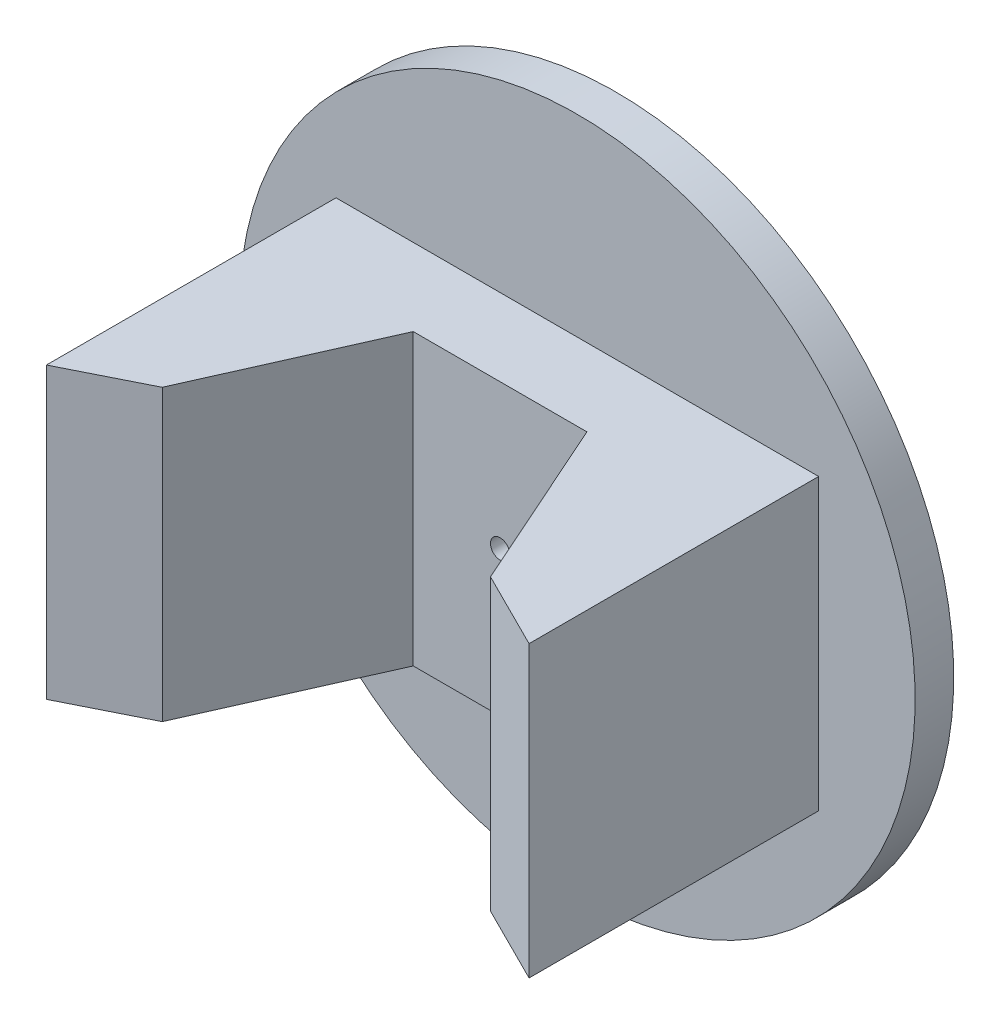
ISO-10303-21;
HEADER;
FILE_DESCRIPTION(('STEP AP214'),'2;1');
FILE_NAME('part.step','',(''),(''),'','','');
FILE_SCHEMA(('AUTOMOTIVE_DESIGN { 1 0 10303 214 1 1 1 1 }'));
ENDSEC;
DATA;
#1=APPLICATION_CONTEXT('core data for automotive mechanical design processes');
#2=APPLICATION_PROTOCOL_DEFINITION('international standard','automotive_design',2000,#1);
#3=PRODUCT_CONTEXT('',#1,'mechanical');
#4=PRODUCT('Part','Part','',(#3));
#5=PRODUCT_RELATED_PRODUCT_CATEGORY('part','',(#4));
#6=PRODUCT_DEFINITION_FORMATION('','',#4);
#7=PRODUCT_DEFINITION_CONTEXT('part definition',#1,'design');
#8=PRODUCT_DEFINITION('design','',#6,#7);
#9=PRODUCT_DEFINITION_SHAPE('','',#8);
#10=(LENGTH_UNIT() NAMED_UNIT(*) SI_UNIT(.MILLI.,.METRE.));
#11=(NAMED_UNIT(*) PLANE_ANGLE_UNIT() SI_UNIT($,.RADIAN.));
#12=(NAMED_UNIT(*) SI_UNIT($,.STERADIAN.) SOLID_ANGLE_UNIT());
#13=UNCERTAINTY_MEASURE_WITH_UNIT(LENGTH_MEASURE(1.E-05),#10,'distance_accuracy_value','');
#14=(GEOMETRIC_REPRESENTATION_CONTEXT(3) GLOBAL_UNCERTAINTY_ASSIGNED_CONTEXT((#13)) GLOBAL_UNIT_ASSIGNED_CONTEXT((#10,
#11,#12)) REPRESENTATION_CONTEXT('',''));
#15=CARTESIAN_POINT('',(0.,0.,0.));
#16=DIRECTION('',(0.,0.,1.));
#17=DIRECTION('',(1.,0.,0.));
#18=AXIS2_PLACEMENT_3D('',#15,#16,#17);
#19=CARTESIAN_POINT('',(0.,7.5,-5.));
#20=DIRECTION('',(0.,0.,-1.));
#21=DIRECTION('',(-1.,0.,0.));
#22=AXIS2_PLACEMENT_3D('',#19,#20,#21);
#23=PLANE('',#22);
#24=CARTESIAN_POINT('',(0.,7.5,-5.));
#25=DIRECTION('',(0.,0.,-1.));
#26=DIRECTION('',(-1.,0.,0.));
#27=AXIS2_PLACEMENT_3D('',#24,#25,#26);
#28=CIRCLE('',#27,9.99999999999999);
#29=CARTESIAN_POINT('',(-10.,7.5,-5.));
#30=VERTEX_POINT('',#29);
#31=EDGE_CURVE('E178',#30,#30,#28,.T.);
#32=ORIENTED_EDGE('',*,*,#31,.T.);
#33=EDGE_LOOP('',(#32));
#34=FACE_BOUND('',#33,.T.);
#35=CARTESIAN_POINT('',(0.,7.5,-5.));
#36=DIRECTION('',(0.,0.,-1.));
#37=DIRECTION('',(-1.,0.,0.));
#38=AXIS2_PLACEMENT_3D('',#35,#36,#37);
#39=CIRCLE('',#38,5.);
#40=CARTESIAN_POINT('',(-5.,7.5,-5.));
#41=VERTEX_POINT('',#40);
#42=EDGE_CURVE('E168',#41,#41,#39,.T.);
#43=ORIENTED_EDGE('',*,*,#42,.F.);
#44=EDGE_LOOP('',(#43));
#45=FACE_BOUND('',#44,.T.);
#46=ADVANCED_FACE('F35',(#34,#45),#23,.T.);
#47=CARTESIAN_POINT('',(0.,7.5,-2.));
#48=DIRECTION('',(0.,0.,-1.));
#49=DIRECTION('',(-1.,0.,0.));
#50=AXIS2_PLACEMENT_3D('',#47,#48,#49);
#51=PLANE('',#50);
#52=CARTESIAN_POINT('',(0.,7.5,-2.));
#53=DIRECTION('',(0.,0.,-1.));
#54=DIRECTION('',(-1.,0.,0.));
#55=AXIS2_PLACEMENT_3D('',#52,#53,#54);
#56=CIRCLE('',#55,17.5);
#57=CARTESIAN_POINT('',(-17.5,7.5,-2.));
#58=VERTEX_POINT('',#57);
#59=EDGE_CURVE('E137',#58,#58,#56,.T.);
#60=ORIENTED_EDGE('',*,*,#59,.T.);
#61=EDGE_LOOP('',(#60));
#62=FACE_BOUND('',#61,.T.);
#63=CARTESIAN_POINT('',(0.,7.5,-2.));
#64=DIRECTION('',(0.,0.,-1.));
#65=DIRECTION('',(-1.,0.,0.));
#66=AXIS2_PLACEMENT_3D('',#63,#64,#65);
#67=CIRCLE('',#66,9.99999999999999);
#68=CARTESIAN_POINT('',(-10.,7.5,-2.));
#69=VERTEX_POINT('',#68);
#70=EDGE_CURVE('E166',#69,#69,#67,.T.);
#71=ORIENTED_EDGE('',*,*,#70,.F.);
#72=EDGE_LOOP('',(#71));
#73=FACE_BOUND('',#72,.T.);
#74=ADVANCED_FACE('F222',(#62,#73),#51,.T.);
#75=CARTESIAN_POINT('',(12.5,15.,15.));
#76=DIRECTION('',(0.447213595499958,0.,-0.894427190999916));
#77=DIRECTION('',(-0.894427190999916,0.,-0.447213595499958));
#78=AXIS2_PLACEMENT_3D('',#75,#76,#77);
#79=PLANE('',#78);
#80=DIRECTION('',(0.894427190999916,0.,0.447213595499958));
#81=VECTOR('',#80,1.);
#82=CARTESIAN_POINT('',(12.5,0.,15.));
#83=LINE('',#82,#81);
#84=CARTESIAN_POINT('',(8.5,0.,13.));
#85=VERTEX_POINT('',#84);
#86=CARTESIAN_POINT('',(12.5,0.,15.));
#87=VERTEX_POINT('',#86);
#88=EDGE_CURVE('E133',#85,#87,#83,.T.);
#89=ORIENTED_EDGE('',*,*,#88,.T.);
#90=DIRECTION('',(0.,-1.,0.));
#91=VECTOR('',#90,1.);
#92=CARTESIAN_POINT('',(12.5,15.,15.));
#93=LINE('',#92,#91);
#94=CARTESIAN_POINT('',(12.5,15.,15.));
#95=VERTEX_POINT('',#94);
#96=EDGE_CURVE('E11',#95,#87,#93,.T.);
#97=ORIENTED_EDGE('',*,*,#96,.F.);
#98=DIRECTION('',(0.894427190999916,0.,0.447213595499958));
#99=VECTOR('',#98,1.);
#100=CARTESIAN_POINT('',(12.5,15.,15.));
#101=LINE('',#100,#99);
#102=CARTESIAN_POINT('',(8.5,15.,13.));
#103=VERTEX_POINT('',#102);
#104=EDGE_CURVE('E149',#103,#95,#101,.T.);
#105=ORIENTED_EDGE('',*,*,#104,.F.);
#106=DIRECTION('',(0.,-1.,0.));
#107=VECTOR('',#106,1.);
#108=CARTESIAN_POINT('',(8.5,15.,13.));
#109=LINE('',#108,#107);
#110=EDGE_CURVE('E129',#103,#85,#109,.T.);
#111=ORIENTED_EDGE('',*,*,#110,.T.);
#112=EDGE_LOOP('',(#89,#97,#105,#111));
#113=FACE_BOUND('',#112,.T.);
#114=ADVANCED_FACE('F37',(#113),#79,.F.);
#115=CARTESIAN_POINT('',(12.5,15.,0.));
#116=DIRECTION('',(-1.,0.,0.));
#117=DIRECTION('',(0.,0.,1.));
#118=AXIS2_PLACEMENT_3D('',#115,#116,#117);
#119=PLANE('',#118);
#120=DIRECTION('',(0.,0.,-1.));
#121=VECTOR('',#120,1.);
#122=CARTESIAN_POINT('',(12.5,0.,0.));
#123=LINE('',#122,#121);
#124=CARTESIAN_POINT('',(12.5,0.,0.));
#125=VERTEX_POINT('',#124);
#126=EDGE_CURVE('E136',#87,#125,#123,.T.);
#127=ORIENTED_EDGE('',*,*,#126,.T.);
#128=DIRECTION('',(0.,-1.,0.));
#129=VECTOR('',#128,1.);
#130=CARTESIAN_POINT('',(12.5,15.,0.));
#131=LINE('',#130,#129);
#132=CARTESIAN_POINT('',(12.5,15.,0.));
#133=VERTEX_POINT('',#132);
#134=EDGE_CURVE('E45',#133,#125,#131,.T.);
#135=ORIENTED_EDGE('',*,*,#134,.F.);
#136=DIRECTION('',(0.,0.,-1.));
#137=VECTOR('',#136,1.);
#138=CARTESIAN_POINT('',(12.5,15.,0.));
#139=LINE('',#138,#137);
#140=EDGE_CURVE('E95',#95,#133,#139,.T.);
#141=ORIENTED_EDGE('',*,*,#140,.F.);
#142=ORIENTED_EDGE('',*,*,#96,.T.);
#143=EDGE_LOOP('',(#127,#135,#141,#142));
#144=FACE_BOUND('',#143,.T.);
#145=ADVANCED_FACE('F362',(#144),#119,.F.);
#146=CARTESIAN_POINT('',(-12.5,15.,0.));
#147=DIRECTION('',(1.,0.,0.));
#148=DIRECTION('',(0.,0.,-1.));
#149=AXIS2_PLACEMENT_3D('',#146,#147,#148);
#150=PLANE('',#149);
#151=DIRECTION('',(0.,0.,1.));
#152=VECTOR('',#151,1.);
#153=CARTESIAN_POINT('',(-12.5,0.,0.));
#154=LINE('',#153,#152);
#155=CARTESIAN_POINT('',(-12.5,0.,0.));
#156=VERTEX_POINT('',#155);
#157=CARTESIAN_POINT('',(-12.5,0.,15.));
#158=VERTEX_POINT('',#157);
#159=EDGE_CURVE('E142',#156,#158,#154,.T.);
#160=ORIENTED_EDGE('',*,*,#159,.T.);
#161=DIRECTION('',(0.,-1.,0.));
#162=VECTOR('',#161,1.);
#163=CARTESIAN_POINT('',(-12.5,15.,15.));
#164=LINE('',#163,#162);
#165=CARTESIAN_POINT('',(-12.5,15.,15.));
#166=VERTEX_POINT('',#165);
#167=EDGE_CURVE('E153',#166,#158,#164,.T.);
#168=ORIENTED_EDGE('',*,*,#167,.F.);
#169=DIRECTION('',(0.,0.,1.));
#170=VECTOR('',#169,1.);
#171=CARTESIAN_POINT('',(-12.5,15.,0.));
#172=LINE('',#171,#170);
#173=CARTESIAN_POINT('',(-12.5,15.,0.));
#174=VERTEX_POINT('',#173);
#175=EDGE_CURVE('E192',#174,#166,#172,.T.);
#176=ORIENTED_EDGE('',*,*,#175,.F.);
#177=DIRECTION('',(0.,-1.,0.));
#178=VECTOR('',#177,1.);
#179=CARTESIAN_POINT('',(-12.5,15.,0.));
#180=LINE('',#179,#178);
#181=EDGE_CURVE('E156',#174,#156,#180,.T.);
#182=ORIENTED_EDGE('',*,*,#181,.T.);
#183=EDGE_LOOP('',(#160,#168,#176,#182));
#184=FACE_BOUND('',#183,.T.);
#185=ADVANCED_FACE('F198',(#184),#150,.F.);
#186=CARTESIAN_POINT('',(-8.5,15.,13.));
#187=DIRECTION('',(-0.447213595499958,0.,-0.894427190999916));
#188=DIRECTION('',(-0.894427190999916,0.,0.447213595499958));
#189=AXIS2_PLACEMENT_3D('',#186,#187,#188);
#190=PLANE('',#189);
#191=DIRECTION('',(0.894427190999916,0.,-0.447213595499958));
#192=VECTOR('',#191,1.);
#193=CARTESIAN_POINT('',(-8.5,0.,13.));
#194=LINE('',#193,#192);
#195=CARTESIAN_POINT('',(-8.5,0.,13.));
#196=VERTEX_POINT('',#195);
#197=EDGE_CURVE('E144',#158,#196,#194,.T.);
#198=ORIENTED_EDGE('',*,*,#197,.T.);
#199=DIRECTION('',(0.,-1.,0.));
#200=VECTOR('',#199,1.);
#201=CARTESIAN_POINT('',(-8.5,15.,13.));
#202=LINE('',#201,#200);
#203=CARTESIAN_POINT('',(-8.5,15.,13.));
#204=VERTEX_POINT('',#203);
#205=EDGE_CURVE('E124',#204,#196,#202,.T.);
#206=ORIENTED_EDGE('',*,*,#205,.F.);
#207=DIRECTION('',(0.894427190999916,0.,-0.447213595499958));
#208=VECTOR('',#207,1.);
#209=CARTESIAN_POINT('',(-8.5,15.,13.));
#210=LINE('',#209,#208);
#211=EDGE_CURVE('E115',#166,#204,#210,.T.);
#212=ORIENTED_EDGE('',*,*,#211,.F.);
#213=ORIENTED_EDGE('',*,*,#167,.T.);
#214=EDGE_LOOP('',(#198,#206,#212,#213));
#215=FACE_BOUND('',#214,.T.);
#216=ADVANCED_FACE('F202',(#215),#190,.F.);
#217=CARTESIAN_POINT('',(-4.5,15.,4.));
#218=DIRECTION('',(-0.913811548620257,0.,-0.406138466053448));
#219=DIRECTION('',(-0.406138466053448,0.,0.913811548620257));
#220=AXIS2_PLACEMENT_3D('',#217,#218,#219);
#221=PLANE('',#220);
#222=DIRECTION('',(0.406138466053448,0.,-0.913811548620257));
#223=VECTOR('',#222,1.);
#224=CARTESIAN_POINT('',(-4.5,0.,4.));
#225=LINE('',#224,#223);
#226=CARTESIAN_POINT('',(-4.5,0.,4.));
#227=VERTEX_POINT('',#226);
#228=EDGE_CURVE('E123',#196,#227,#225,.T.);
#229=ORIENTED_EDGE('',*,*,#228,.T.);
#230=DIRECTION('',(0.,-1.,0.));
#231=VECTOR('',#230,1.);
#232=CARTESIAN_POINT('',(-4.5,15.,4.));
#233=LINE('',#232,#231);
#234=CARTESIAN_POINT('',(-4.5,15.,4.));
#235=VERTEX_POINT('',#234);
#236=EDGE_CURVE('E120',#235,#227,#233,.T.);
#237=ORIENTED_EDGE('',*,*,#236,.F.);
#238=DIRECTION('',(0.406138466053448,0.,-0.913811548620257));
#239=VECTOR('',#238,1.);
#240=CARTESIAN_POINT('',(-4.5,15.,4.));
#241=LINE('',#240,#239);
#242=EDGE_CURVE('E109',#204,#235,#241,.T.);
#243=ORIENTED_EDGE('',*,*,#242,.F.);
#244=ORIENTED_EDGE('',*,*,#205,.T.);
#245=EDGE_LOOP('',(#229,#237,#243,#244));
#246=FACE_BOUND('',#245,.T.);
#247=ADVANCED_FACE('F121',(#246),#221,.F.);
#248=CARTESIAN_POINT('',(4.5,15.,4.));
#249=DIRECTION('',(0.,0.,-1.));
#250=DIRECTION('',(-1.,0.,0.));
#251=AXIS2_PLACEMENT_3D('',#248,#249,#250);
#252=PLANE('',#251);
#253=CARTESIAN_POINT('',(0.,7.5,4.));
#254=DIRECTION('',(0.,0.,-1.));
#255=DIRECTION('',(-1.,0.,0.));
#256=AXIS2_PLACEMENT_3D('',#253,#254,#255);
#257=CIRCLE('',#256,0.500000000000002);
#258=CARTESIAN_POINT('',(-0.500000000000002,7.5,4.));
#259=VERTEX_POINT('',#258);
#260=EDGE_CURVE('E173',#259,#259,#257,.T.);
#261=ORIENTED_EDGE('',*,*,#260,.T.);
#262=EDGE_LOOP('',(#261));
#263=FACE_BOUND('',#262,.T.);
#264=DIRECTION('',(1.,0.,0.));
#265=VECTOR('',#264,1.);
#266=CARTESIAN_POINT('',(4.5,0.,4.));
#267=LINE('',#266,#265);
#268=CARTESIAN_POINT('',(4.5,0.,4.));
#269=VERTEX_POINT('',#268);
#270=EDGE_CURVE('E81',#227,#269,#267,.T.);
#271=ORIENTED_EDGE('',*,*,#270,.T.);
#272=DIRECTION('',(0.,-1.,0.));
#273=VECTOR('',#272,1.);
#274=CARTESIAN_POINT('',(4.5,15.,4.));
#275=LINE('',#274,#273);
#276=CARTESIAN_POINT('',(4.5,15.,4.));
#277=VERTEX_POINT('',#276);
#278=EDGE_CURVE('E125',#277,#269,#275,.T.);
#279=ORIENTED_EDGE('',*,*,#278,.F.);
#280=DIRECTION('',(1.,0.,0.));
#281=VECTOR('',#280,1.);
#282=CARTESIAN_POINT('',(4.5,15.,4.));
#283=LINE('',#282,#281);
#284=EDGE_CURVE('E113',#235,#277,#283,.T.);
#285=ORIENTED_EDGE('',*,*,#284,.F.);
#286=ORIENTED_EDGE('',*,*,#236,.T.);
#287=EDGE_LOOP('',(#271,#279,#285,#286));
#288=FACE_BOUND('',#287,.T.);
#289=ADVANCED_FACE('F127',(#263,#288),#252,.F.);
#290=CARTESIAN_POINT('',(8.5,15.,13.));
#291=DIRECTION('',(0.913811548620257,0.,-0.406138466053448));
#292=DIRECTION('',(-0.406138466053448,0.,-0.913811548620257));
#293=AXIS2_PLACEMENT_3D('',#290,#291,#292);
#294=PLANE('',#293);
#295=DIRECTION('',(0.406138466053448,0.,0.913811548620257));
#296=VECTOR('',#295,1.);
#297=CARTESIAN_POINT('',(8.5,0.,13.));
#298=LINE('',#297,#296);
#299=EDGE_CURVE('E87',#269,#85,#298,.T.);
#300=ORIENTED_EDGE('',*,*,#299,.T.);
#301=ORIENTED_EDGE('',*,*,#110,.F.);
#302=DIRECTION('',(0.406138466053448,0.,0.913811548620257));
#303=VECTOR('',#302,1.);
#304=CARTESIAN_POINT('',(8.5,15.,13.));
#305=LINE('',#304,#303);
#306=EDGE_CURVE('E54',#277,#103,#305,.T.);
#307=ORIENTED_EDGE('',*,*,#306,.F.);
#308=ORIENTED_EDGE('',*,*,#278,.T.);
#309=EDGE_LOOP('',(#300,#301,#307,#308));
#310=FACE_BOUND('',#309,.T.);
#311=ADVANCED_FACE('F210',(#310),#294,.F.);
#312=CARTESIAN_POINT('',(-5.40909090909091,15.,6.04545454545454));
#313=DIRECTION('',(0.,1.,0.));
#314=DIRECTION('',(0.,0.,1.));
#315=AXIS2_PLACEMENT_3D('',#312,#313,#314);
#316=PLANE('',#315);
#317=ORIENTED_EDGE('',*,*,#104,.T.);
#318=ORIENTED_EDGE('',*,*,#140,.T.);
#319=DIRECTION('',(-1.,0.,0.));
#320=VECTOR('',#319,1.);
#321=CARTESIAN_POINT('',(-12.5,15.,0.));
#322=LINE('',#321,#320);
#323=EDGE_CURVE('E190',#133,#174,#322,.T.);
#324=ORIENTED_EDGE('',*,*,#323,.T.);
#325=ORIENTED_EDGE('',*,*,#175,.T.);
#326=ORIENTED_EDGE('',*,*,#211,.T.);
#327=ORIENTED_EDGE('',*,*,#242,.T.);
#328=ORIENTED_EDGE('',*,*,#284,.T.);
#329=ORIENTED_EDGE('',*,*,#306,.T.);
#330=EDGE_LOOP('',(#317,#318,#324,#325,#326,#327,#328,#329));
#331=FACE_BOUND('',#330,.T.);
#332=ADVANCED_FACE('F111',(#331),#316,.T.);
#333=CARTESIAN_POINT('',(-5.40909090909091,0.,6.04545454545454));
#334=DIRECTION('',(0.,1.,0.));
#335=DIRECTION('',(0.,0.,1.));
#336=AXIS2_PLACEMENT_3D('',#333,#334,#335);
#337=PLANE('',#336);
#338=ORIENTED_EDGE('',*,*,#88,.F.);
#339=ORIENTED_EDGE('',*,*,#299,.F.);
#340=ORIENTED_EDGE('',*,*,#270,.F.);
#341=ORIENTED_EDGE('',*,*,#228,.F.);
#342=ORIENTED_EDGE('',*,*,#197,.F.);
#343=ORIENTED_EDGE('',*,*,#159,.F.);
#344=DIRECTION('',(-1.,0.,0.));
#345=VECTOR('',#344,1.);
#346=CARTESIAN_POINT('',(-12.5,0.,0.));
#347=LINE('',#346,#345);
#348=EDGE_CURVE('E139',#125,#156,#347,.T.);
#349=ORIENTED_EDGE('',*,*,#348,.F.);
#350=ORIENTED_EDGE('',*,*,#126,.F.);
#351=EDGE_LOOP('',(#338,#339,#340,#341,#342,#343,#349,#350));
#352=FACE_BOUND('',#351,.T.);
#353=ADVANCED_FACE('F205',(#352),#337,.F.);
#354=CARTESIAN_POINT('',(0.,7.5,-2.));
#355=DIRECTION('',(0.,0.,1.));
#356=DIRECTION('',(1.,0.,0.));
#357=AXIS2_PLACEMENT_3D('',#354,#355,#356);
#358=CYLINDRICAL_SURFACE('',#357,17.5);
#359=ORIENTED_EDGE('',*,*,#59,.F.);
#360=EDGE_LOOP('',(#359));
#361=FACE_BOUND('',#360,.T.);
#362=CARTESIAN_POINT('',(0.,7.5,0.));
#363=DIRECTION('',(0.,0.,-1.));
#364=DIRECTION('',(-1.,0.,0.));
#365=AXIS2_PLACEMENT_3D('',#362,#363,#364);
#366=CIRCLE('',#365,17.5);
#367=CARTESIAN_POINT('',(-17.5,7.5,0.));
#368=VERTEX_POINT('',#367);
#369=EDGE_CURVE('E181',#368,#368,#366,.T.);
#370=ORIENTED_EDGE('',*,*,#369,.T.);
#371=EDGE_LOOP('',(#370));
#372=FACE_BOUND('',#371,.T.);
#373=ADVANCED_FACE('F242',(#361,#372),#358,.T.);
#374=CARTESIAN_POINT('',(0.,7.5,0.));
#375=DIRECTION('',(0.,0.,-1.));
#376=DIRECTION('',(-1.,0.,0.));
#377=AXIS2_PLACEMENT_3D('',#374,#375,#376);
#378=PLANE('',#377);
#379=ORIENTED_EDGE('',*,*,#323,.F.);
#380=ORIENTED_EDGE('',*,*,#134,.T.);
#381=ORIENTED_EDGE('',*,*,#348,.T.);
#382=ORIENTED_EDGE('',*,*,#181,.F.);
#383=EDGE_LOOP('',(#379,#380,#381,#382));
#384=FACE_BOUND('',#383,.T.);
#385=ORIENTED_EDGE('',*,*,#369,.F.);
#386=EDGE_LOOP('',(#385));
#387=FACE_BOUND('',#386,.T.);
#388=ADVANCED_FACE('F237',(#384,#387),#378,.F.);
#389=CARTESIAN_POINT('',(0.,7.5,-5.));
#390=DIRECTION('',(0.,0.,1.));
#391=DIRECTION('',(1.,0.,0.));
#392=AXIS2_PLACEMENT_3D('',#389,#390,#391);
#393=CYLINDRICAL_SURFACE('',#392,9.99999999999999);
#394=CARTESIAN_POINT('',(0.,7.5,-2.75));
#395=DIRECTION('',(0.,0.,-1.));
#396=DIRECTION('',(-1.,0.,0.));
#397=AXIS2_PLACEMENT_3D('',#394,#395,#396);
#398=CIRCLE('',#397,9.99999999999999);
#399=CARTESIAN_POINT('',(-10.,7.5,-2.75));
#400=VERTEX_POINT('',#399);
#401=EDGE_CURVE('E160',#400,#400,#398,.F.);
#402=ORIENTED_EDGE('',*,*,#401,.T.);
#403=EDGE_LOOP('',(#402));
#404=FACE_BOUND('',#403,.T.);
#405=ORIENTED_EDGE('',*,*,#70,.T.);
#406=EDGE_LOOP('',(#405));
#407=FACE_BOUND('',#406,.T.);
#408=ADVANCED_FACE('F235',(#404,#407),#393,.T.);
#409=CARTESIAN_POINT('',(0.,7.5,-3.5));
#410=DIRECTION('',(0.,0.,-1.));
#411=DIRECTION('',(-1.,0.,0.));
#412=AXIS2_PLACEMENT_3D('',#409,#410,#411);
#413=TOROIDAL_SURFACE('',#412,9.99999999999999,0.749999999999999);
#414=ORIENTED_EDGE('',*,*,#401,.F.);
#415=EDGE_LOOP('',(#414));
#416=FACE_BOUND('',#415,.T.);
#417=CARTESIAN_POINT('',(0.,7.5,-4.25));
#418=DIRECTION('',(0.,0.,1.));
#419=DIRECTION('',(1.,0.,0.));
#420=AXIS2_PLACEMENT_3D('',#417,#418,#419);
#421=CIRCLE('',#420,9.99999999999999);
#422=CARTESIAN_POINT('',(9.99999999999999,7.5,-4.25));
#423=VERTEX_POINT('',#422);
#424=EDGE_CURVE('E39',#423,#423,#421,.F.);
#425=ORIENTED_EDGE('',*,*,#424,.F.);
#426=EDGE_LOOP('',(#425));
#427=FACE_BOUND('',#426,.T.);
#428=ADVANCED_FACE('F233',(#416,#427),#413,.F.);
#429=ORIENTED_EDGE('',*,*,#424,.T.);
#430=EDGE_LOOP('',(#429));
#431=FACE_BOUND('',#430,.T.);
#432=ORIENTED_EDGE('',*,*,#31,.F.);
#433=EDGE_LOOP('',(#432));
#434=FACE_BOUND('',#433,.T.);
#435=ADVANCED_FACE('F238',(#431,#434),#393,.T.);
#436=CARTESIAN_POINT('',(0.,7.5,-8.));
#437=DIRECTION('',(0.,0.,1.));
#438=DIRECTION('',(1.,0.,0.));
#439=AXIS2_PLACEMENT_3D('',#436,#437,#438);
#440=CYLINDRICAL_SURFACE('',#439,5.);
#441=CARTESIAN_POINT('',(0.,7.5,-8.));
#442=DIRECTION('',(0.,0.,-1.));
#443=DIRECTION('',(-1.,0.,0.));
#444=AXIS2_PLACEMENT_3D('',#441,#442,#443);
#445=CIRCLE('',#444,5.);
#446=CARTESIAN_POINT('',(-5.00000000000001,7.5,-8.));
#447=VERTEX_POINT('',#446);
#448=EDGE_CURVE('E162',#447,#447,#445,.T.);
#449=ORIENTED_EDGE('',*,*,#448,.F.);
#450=EDGE_LOOP('',(#449));
#451=FACE_BOUND('',#450,.T.);
#452=ORIENTED_EDGE('',*,*,#42,.T.);
#453=EDGE_LOOP('',(#452));
#454=FACE_BOUND('',#453,.T.);
#455=ADVANCED_FACE('F276',(#451,#454),#440,.T.);
#456=CARTESIAN_POINT('',(0.,7.5,-8.));
#457=DIRECTION('',(0.,0.,-1.));
#458=DIRECTION('',(-1.,0.,0.));
#459=AXIS2_PLACEMENT_3D('',#456,#457,#458);
#460=PLANE('',#459);
#461=CARTESIAN_POINT('',(0.,7.5,-8.));
#462=DIRECTION('',(0.,0.,-1.));
#463=DIRECTION('',(-1.,0.,0.));
#464=AXIS2_PLACEMENT_3D('',#461,#462,#463);
#465=CIRCLE('',#464,0.500000000000002);
#466=CARTESIAN_POINT('',(-0.500000000000006,7.5,-8.));
#467=VERTEX_POINT('',#466);
#468=EDGE_CURVE('E387',#467,#467,#465,.T.);
#469=ORIENTED_EDGE('',*,*,#468,.F.);
#470=EDGE_LOOP('',(#469));
#471=FACE_BOUND('',#470,.T.);
#472=ORIENTED_EDGE('',*,*,#448,.T.);
#473=EDGE_LOOP('',(#472));
#474=FACE_BOUND('',#473,.T.);
#475=ADVANCED_FACE('F283',(#471,#474),#460,.T.);
#476=CARTESIAN_POINT('',(0.,7.5,15.));
#477=DIRECTION('',(0.,0.,-1.));
#478=DIRECTION('',(-1.,0.,0.));
#479=AXIS2_PLACEMENT_3D('',#476,#477,#478);
#480=CYLINDRICAL_SURFACE('',#479,0.500000000000002);
#481=ORIENTED_EDGE('',*,*,#468,.T.);
#482=EDGE_LOOP('',(#481));
#483=FACE_BOUND('',#482,.T.);
#484=ORIENTED_EDGE('',*,*,#260,.F.);
#485=EDGE_LOOP('',(#484));
#486=FACE_BOUND('',#485,.T.);
#487=ADVANCED_FACE('F291',(#483,#486),#480,.F.);
#488=CLOSED_SHELL('',(#46,#74,#114,#145,#185,#216,#247,#289,#311,#332,#353,#373,#388,#408,#428,
#435,#455,#475,#487));
#489=MANIFOLD_SOLID_BREP('B2',#488);
#490=ADVANCED_BREP_SHAPE_REPRESENTATION('',(#18,#489),#14);
#491=SHAPE_DEFINITION_REPRESENTATION(#9,#490);
ENDSEC;
END-ISO-10303-21;
